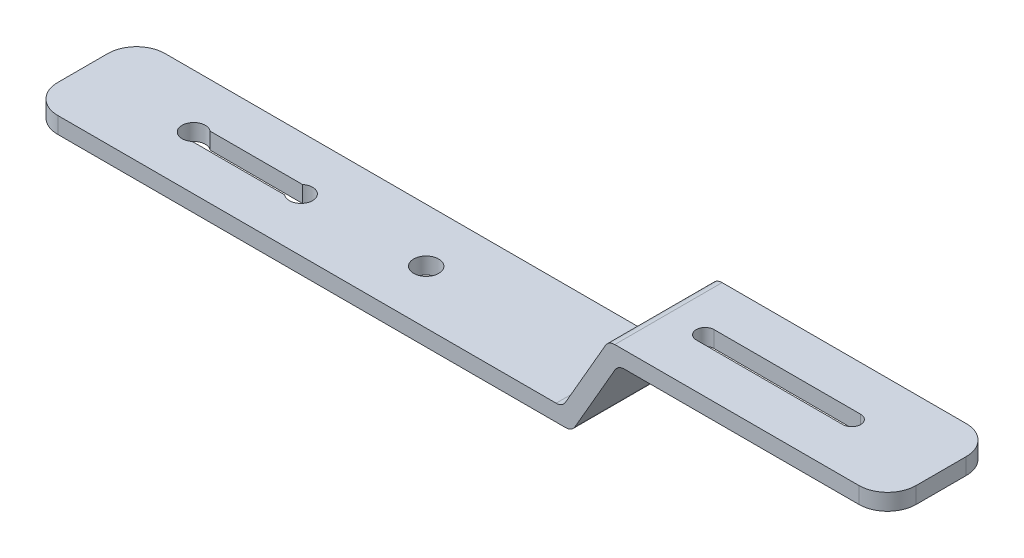
ISO-10303-21;
HEADER;
FILE_DESCRIPTION(('STEP AP214'),'2;1');
FILE_NAME('part.step','',(''),(''),'','','');
FILE_SCHEMA(('AUTOMOTIVE_DESIGN { 1 0 10303 214 1 1 1 1 }'));
ENDSEC;
DATA;
#1=APPLICATION_CONTEXT('core data for automotive mechanical design processes');
#2=APPLICATION_PROTOCOL_DEFINITION('international standard','automotive_design',2000,#1);
#3=PRODUCT_CONTEXT('',#1,'mechanical');
#4=PRODUCT('Part','Part','',(#3));
#5=PRODUCT_RELATED_PRODUCT_CATEGORY('part','',(#4));
#6=PRODUCT_DEFINITION_FORMATION('','',#4);
#7=PRODUCT_DEFINITION_CONTEXT('part definition',#1,'design');
#8=PRODUCT_DEFINITION('design','',#6,#7);
#9=PRODUCT_DEFINITION_SHAPE('','',#8);
#10=(LENGTH_UNIT() NAMED_UNIT(*) SI_UNIT(.MILLI.,.METRE.));
#11=(NAMED_UNIT(*) PLANE_ANGLE_UNIT() SI_UNIT($,.RADIAN.));
#12=(NAMED_UNIT(*) SI_UNIT($,.STERADIAN.) SOLID_ANGLE_UNIT());
#13=UNCERTAINTY_MEASURE_WITH_UNIT(LENGTH_MEASURE(1.E-05),#10,'distance_accuracy_value','');
#14=(GEOMETRIC_REPRESENTATION_CONTEXT(3) GLOBAL_UNCERTAINTY_ASSIGNED_CONTEXT((#13)) GLOBAL_UNIT_ASSIGNED_CONTEXT((#10,
#11,#12)) REPRESENTATION_CONTEXT('',''));
#15=CARTESIAN_POINT('',(0.,0.,0.));
#16=DIRECTION('',(0.,0.,1.));
#17=DIRECTION('',(1.,0.,0.));
#18=AXIS2_PLACEMENT_3D('',#15,#16,#17);
#19=CARTESIAN_POINT('',(0.,4.6,15.));
#20=DIRECTION('',(1.,0.,0.));
#21=DIRECTION('',(0.,1.,0.));
#22=AXIS2_PLACEMENT_3D('',#19,#20,#21);
#23=PLANE('',#22);
#24=DIRECTION('',(0.,0.,-1.));
#25=VECTOR('',#24,1.);
#26=CARTESIAN_POINT('',(0.,0.,15.));
#27=LINE('',#26,#25);
#28=CARTESIAN_POINT('',(0.,0.,7.));
#29=VERTEX_POINT('',#28);
#30=CARTESIAN_POINT('',(0.,0.,-7.));
#31=VERTEX_POINT('',#30);
#32=EDGE_CURVE('E356',#29,#31,#27,.T.);
#33=ORIENTED_EDGE('',*,*,#32,.F.);
#34=DIRECTION('',(0.,-1.,0.));
#35=VECTOR('',#34,1.);
#36=CARTESIAN_POINT('',(0.,4.6,7.));
#37=LINE('',#36,#35);
#38=CARTESIAN_POINT('',(0.,4.6,7.));
#39=VERTEX_POINT('',#38);
#40=EDGE_CURVE('E387',#29,#39,#37,.F.);
#41=ORIENTED_EDGE('',*,*,#40,.T.);
#42=DIRECTION('',(0.,0.,-1.));
#43=VECTOR('',#42,1.);
#44=CARTESIAN_POINT('',(0.,4.6,15.));
#45=LINE('',#44,#43);
#46=CARTESIAN_POINT('',(0.,4.6,-7.));
#47=VERTEX_POINT('',#46);
#48=EDGE_CURVE('E303',#39,#47,#45,.T.);
#49=ORIENTED_EDGE('',*,*,#48,.T.);
#50=DIRECTION('',(0.,-1.,0.));
#51=VECTOR('',#50,1.);
#52=CARTESIAN_POINT('',(0.,0.,-7.));
#53=LINE('',#52,#51);
#54=EDGE_CURVE('E384',#47,#31,#53,.T.);
#55=ORIENTED_EDGE('',*,*,#54,.T.);
#56=EDGE_LOOP('',(#33,#41,#49,#55));
#57=FACE_BOUND('',#56,.T.);
#58=ADVANCED_FACE('F35',(#57),#23,.F.);
#59=CARTESIAN_POINT('',(150.,-1.0495153170664E-12,15.));
#60=DIRECTION('',(0.,1.,0.));
#61=DIRECTION('',(-1.,0.,0.));
#62=AXIS2_PLACEMENT_3D('',#59,#60,#61);
#63=PLANE('',#62);
#64=CARTESIAN_POINT('',(96.,-1.7277845820729E-12,0.));
#65=DIRECTION('',(0.,1.,0.));
#66=DIRECTION('',(-1.,0.,0.));
#67=AXIS2_PLACEMENT_3D('',#64,#65,#66);
#68=CIRCLE('',#67,3.50000000000001);
#69=CARTESIAN_POINT('',(92.5,-1.70334915231725E-12,0.));
#70=VERTEX_POINT('',#69);
#71=EDGE_CURVE('E242',#70,#70,#68,.T.);
#72=ORIENTED_EDGE('',*,*,#71,.T.);
#73=EDGE_LOOP('',(#72));
#74=FACE_BOUND('',#73,.T.);
#75=DIRECTION('',(-1.,0.,0.));
#76=VECTOR('',#75,1.);
#77=CARTESIAN_POINT('',(33.0766559657296,-1.05731395860786E-12,-2.5));
#78=LINE('',#77,#76);
#79=CARTESIAN_POINT('',(58.9233440342705,-1.0547118733939E-12,-2.5));
#80=VERTEX_POINT('',#79);
#81=CARTESIAN_POINT('',(33.0766559657296,-1.05731395860786E-12,-2.5));
#82=VERTEX_POINT('',#81);
#83=EDGE_CURVE('E258',#80,#82,#78,.T.);
#84=ORIENTED_EDGE('',*,*,#83,.T.);
#85=CARTESIAN_POINT('',(31.,-1.05731395860786E-12,0.));
#86=DIRECTION('',(0.,1.,0.));
#87=DIRECTION('',(-1.,0.,0.));
#88=AXIS2_PLACEMENT_3D('',#85,#86,#87);
#89=CIRCLE('',#88,3.25);
#90=CARTESIAN_POINT('',(33.0766559657296,-1.05731395860786E-12,2.5));
#91=VERTEX_POINT('',#90);
#92=EDGE_CURVE('E248',#82,#91,#89,.T.);
#93=ORIENTED_EDGE('',*,*,#92,.T.);
#94=DIRECTION('',(1.,0.,0.));
#95=VECTOR('',#94,1.);
#96=CARTESIAN_POINT('',(33.0766559657296,-1.05731395860786E-12,2.5));
#97=LINE('',#96,#95);
#98=CARTESIAN_POINT('',(58.9233440342705,-4.12273013978266E-13,2.5));
#99=VERTEX_POINT('',#98);
#100=EDGE_CURVE('E251',#91,#99,#97,.T.);
#101=ORIENTED_EDGE('',*,*,#100,.T.);
#102=CARTESIAN_POINT('',(61.,-1.0547118733939E-12,0.));
#103=DIRECTION('',(0.,1.,0.));
#104=DIRECTION('',(1.,0.,0.));
#105=AXIS2_PLACEMENT_3D('',#102,#103,#104);
#106=CIRCLE('',#105,3.25);
#107=EDGE_CURVE('E255',#99,#80,#106,.T.);
#108=ORIENTED_EDGE('',*,*,#107,.T.);
#109=EDGE_LOOP('',(#84,#93,#101,#108));
#110=FACE_BOUND('',#109,.T.);
#111=DIRECTION('',(1.,0.,0.));
#112=VECTOR('',#111,1.);
#113=CARTESIAN_POINT('',(150.,-1.0495153170664E-12,15.));
#114=LINE('',#113,#112);
#115=CARTESIAN_POINT('',(8.00000000000001,0.,15.));
#116=VERTEX_POINT('',#115);
#117=CARTESIAN_POINT('',(150.,-1.04083408558608E-12,15.));
#118=VERTEX_POINT('',#117);
#119=EDGE_CURVE('E280',#116,#118,#114,.T.);
#120=ORIENTED_EDGE('',*,*,#119,.F.);
#121=CARTESIAN_POINT('',(8.00000000000001,0.,7.));
#122=DIRECTION('',(0.,1.,0.));
#123=DIRECTION('',(-1.,0.,0.));
#124=AXIS2_PLACEMENT_3D('',#121,#122,#123);
#125=CIRCLE('',#124,8.);
#126=EDGE_CURVE('E382',#116,#29,#125,.F.);
#127=ORIENTED_EDGE('',*,*,#126,.T.);
#128=ORIENTED_EDGE('',*,*,#32,.T.);
#129=CARTESIAN_POINT('',(8.,0.,-7.));
#130=DIRECTION('',(0.,1.,0.));
#131=DIRECTION('',(-1.,0.,0.));
#132=AXIS2_PLACEMENT_3D('',#129,#130,#131);
#133=CIRCLE('',#132,8.);
#134=CARTESIAN_POINT('',(8.00000000000001,0.,-15.));
#135=VERTEX_POINT('',#134);
#136=EDGE_CURVE('E380',#31,#135,#133,.F.);
#137=ORIENTED_EDGE('',*,*,#136,.T.);
#138=DIRECTION('',(1.,0.,0.));
#139=VECTOR('',#138,1.);
#140=CARTESIAN_POINT('',(150.,-1.0495153170664E-12,-15.));
#141=LINE('',#140,#139);
#142=CARTESIAN_POINT('',(150.,-1.04083408558608E-12,-15.));
#143=VERTEX_POINT('',#142);
#144=EDGE_CURVE('E273',#135,#143,#141,.T.);
#145=ORIENTED_EDGE('',*,*,#144,.T.);
#146=DIRECTION('',(0.,0.,-1.));
#147=VECTOR('',#146,1.);
#148=CARTESIAN_POINT('',(150.,-1.04083408558608E-12,15.));
#149=LINE('',#148,#147);
#150=EDGE_CURVE('E353',#118,#143,#149,.T.);
#151=ORIENTED_EDGE('',*,*,#150,.F.);
#152=EDGE_LOOP('',(#120,#127,#128,#137,#145,#151));
#153=FACE_BOUND('',#152,.T.);
#154=ADVANCED_FACE('F403',(#74,#110,#153),#63,.F.);
#155=CARTESIAN_POINT('',(150.,2.99999999999949,15.));
#156=DIRECTION('',(0.,0.,-1.));
#157=DIRECTION('',(-1.,0.,0.));
#158=AXIS2_PLACEMENT_3D('',#155,#156,#157);
#159=CYLINDRICAL_SURFACE('',#158,3.00000000000053);
#160=CARTESIAN_POINT('',(150.,2.99999999999949,-15.));
#161=DIRECTION('',(0.,0.,1.));
#162=DIRECTION('',(-1.,0.,0.));
#163=AXIS2_PLACEMENT_3D('',#160,#161,#162);
#164=CIRCLE('',#163,3.00000000000053);
#165=CARTESIAN_POINT('',(152.598076211354,1.49999999999923,-15.));
#166=VERTEX_POINT('',#165);
#167=EDGE_CURVE('E305',#143,#166,#164,.T.);
#168=ORIENTED_EDGE('',*,*,#167,.T.);
#169=DIRECTION('',(0.,0.,-1.));
#170=VECTOR('',#169,1.);
#171=CARTESIAN_POINT('',(152.598076211354,1.49999999999923,15.));
#172=LINE('',#171,#170);
#173=CARTESIAN_POINT('',(152.598076211354,1.49999999999923,15.));
#174=VERTEX_POINT('',#173);
#175=EDGE_CURVE('E350',#174,#166,#172,.T.);
#176=ORIENTED_EDGE('',*,*,#175,.F.);
#177=CARTESIAN_POINT('',(150.,2.99999999999949,15.));
#178=DIRECTION('',(0.,0.,1.));
#179=DIRECTION('',(-1.,0.,0.));
#180=AXIS2_PLACEMENT_3D('',#177,#178,#179);
#181=CIRCLE('',#180,3.00000000000053);
#182=EDGE_CURVE('E282',#118,#174,#181,.T.);
#183=ORIENTED_EDGE('',*,*,#182,.F.);
#184=ORIENTED_EDGE('',*,*,#150,.T.);
#185=EDGE_LOOP('',(#168,#176,#183,#184));
#186=FACE_BOUND('',#185,.T.);
#187=ADVANCED_FACE('F413',(#186),#159,.T.);
#188=CARTESIAN_POINT('',(159.381107666143,13.2485551090319,15.));
#189=DIRECTION('',(-0.866025403784444,0.49999999999999,0.));
#190=DIRECTION('',(-0.49999999999999,-0.866025403784444,0.));
#191=AXIS2_PLACEMENT_3D('',#188,#189,#190);
#192=PLANE('',#191);
#193=DIRECTION('',(0.49999999999999,0.866025403784444,0.));
#194=VECTOR('',#193,1.);
#195=CARTESIAN_POINT('',(159.381107666143,13.2485551090319,-15.));
#196=LINE('',#195,#194);
#197=CARTESIAN_POINT('',(163.79867143363,20.8999999999955,-15.));
#198=VERTEX_POINT('',#197);
#199=EDGE_CURVE('E308',#166,#198,#196,.T.);
#200=ORIENTED_EDGE('',*,*,#199,.T.);
#201=DIRECTION('',(0.,0.,-1.));
#202=VECTOR('',#201,1.);
#203=CARTESIAN_POINT('',(163.79867143363,20.8999999999955,15.));
#204=LINE('',#203,#202);
#205=CARTESIAN_POINT('',(163.79867143363,20.8999999999955,15.));
#206=VERTEX_POINT('',#205);
#207=EDGE_CURVE('E347',#206,#198,#204,.T.);
#208=ORIENTED_EDGE('',*,*,#207,.F.);
#209=DIRECTION('',(0.500000000000007,0.866025403784434,0.));
#210=VECTOR('',#209,1.);
#211=CARTESIAN_POINT('',(159.381107666143,13.2485551090319,15.));
#212=LINE('',#211,#210);
#213=EDGE_CURVE('E285',#174,#206,#212,.T.);
#214=ORIENTED_EDGE('',*,*,#213,.F.);
#215=ORIENTED_EDGE('',*,*,#175,.T.);
#216=EDGE_LOOP('',(#200,#208,#214,#215));
#217=FACE_BOUND('',#216,.T.);
#218=ADVANCED_FACE('F417',(#217),#192,.F.);
#219=CARTESIAN_POINT('',(166.396747644983,19.3999999999958,15.));
#220=DIRECTION('',(0.,0.,-1.));
#221=DIRECTION('',(-1.,0.,0.));
#222=AXIS2_PLACEMENT_3D('',#219,#220,#221);
#223=CYLINDRICAL_SURFACE('',#222,2.99999999999956);
#224=CARTESIAN_POINT('',(166.396747644983,19.3999999999958,-15.));
#225=DIRECTION('',(0.,0.,-1.));
#226=DIRECTION('',(-1.,0.,0.));
#227=AXIS2_PLACEMENT_3D('',#224,#225,#226);
#228=CIRCLE('',#227,2.99999999999956);
#229=CARTESIAN_POINT('',(166.396747644983,22.3999999999953,-15.));
#230=VERTEX_POINT('',#229);
#231=EDGE_CURVE('E310',#198,#230,#228,.T.);
#232=ORIENTED_EDGE('',*,*,#231,.T.);
#233=DIRECTION('',(0.,0.,-1.));
#234=VECTOR('',#233,1.);
#235=CARTESIAN_POINT('',(166.396747644983,22.3999999999953,15.));
#236=LINE('',#235,#234);
#237=CARTESIAN_POINT('',(166.396747644983,22.3999999999953,15.));
#238=VERTEX_POINT('',#237);
#239=EDGE_CURVE('E344',#238,#230,#236,.T.);
#240=ORIENTED_EDGE('',*,*,#239,.F.);
#241=CARTESIAN_POINT('',(166.396747644983,19.3999999999958,15.));
#242=DIRECTION('',(0.,0.,-1.));
#243=DIRECTION('',(-1.,0.,0.));
#244=AXIS2_PLACEMENT_3D('',#241,#242,#243);
#245=CIRCLE('',#244,2.99999999999956);
#246=EDGE_CURVE('E287',#206,#238,#245,.T.);
#247=ORIENTED_EDGE('',*,*,#246,.F.);
#248=ORIENTED_EDGE('',*,*,#207,.T.);
#249=EDGE_LOOP('',(#232,#240,#247,#248));
#250=FACE_BOUND('',#249,.T.);
#251=ADVANCED_FACE('F424',(#250),#223,.F.);
#252=CARTESIAN_POINT('',(166.396747644983,22.3999999999953,15.));
#253=DIRECTION('',(0.,1.,0.));
#254=DIRECTION('',(-1.,0.,0.));
#255=AXIS2_PLACEMENT_3D('',#252,#253,#254);
#256=PLANE('',#255);
#257=DIRECTION('',(1.,0.,0.));
#258=VECTOR('',#257,1.);
#259=CARTESIAN_POINT('',(166.396747644983,22.3999999999953,2.5));
#260=LINE('',#259,#258);
#261=CARTESIAN_POINT('',(174.,22.3999999999953,2.5));
#262=VERTEX_POINT('',#261);
#263=CARTESIAN_POINT('',(215.,22.3999999999951,2.5));
#264=VERTEX_POINT('',#263);
#265=EDGE_CURVE('E235',#262,#264,#260,.T.);
#266=ORIENTED_EDGE('',*,*,#265,.T.);
#267=CARTESIAN_POINT('',(215.,22.399999999995,0.));
#268=DIRECTION('',(0.,1.,0.));
#269=DIRECTION('',(-1.,0.,0.));
#270=AXIS2_PLACEMENT_3D('',#267,#268,#269);
#271=CIRCLE('',#270,2.5);
#272=CARTESIAN_POINT('',(215.,22.3999999999951,-2.5));
#273=VERTEX_POINT('',#272);
#274=EDGE_CURVE('E238',#264,#273,#271,.T.);
#275=ORIENTED_EDGE('',*,*,#274,.T.);
#276=DIRECTION('',(-1.,0.,0.));
#277=VECTOR('',#276,1.);
#278=CARTESIAN_POINT('',(166.396747644983,22.3999999999953,-2.5));
#279=LINE('',#278,#277);
#280=CARTESIAN_POINT('',(173.999999999999,22.3999999999953,-2.5));
#281=VERTEX_POINT('',#280);
#282=EDGE_CURVE('E230',#273,#281,#279,.T.);
#283=ORIENTED_EDGE('',*,*,#282,.T.);
#284=CARTESIAN_POINT('',(174.,22.3999999999953,0.));
#285=DIRECTION('',(0.,1.,0.));
#286=DIRECTION('',(-1.,0.,0.));
#287=AXIS2_PLACEMENT_3D('',#284,#285,#286);
#288=CIRCLE('',#287,2.5);
#289=EDGE_CURVE('E205',#281,#262,#288,.T.);
#290=ORIENTED_EDGE('',*,*,#289,.T.);
#291=EDGE_LOOP('',(#266,#275,#283,#290));
#292=FACE_BOUND('',#291,.T.);
#293=DIRECTION('',(1.,0.,0.));
#294=VECTOR('',#293,1.);
#295=CARTESIAN_POINT('',(166.396747644983,22.3999999999953,-15.));
#296=LINE('',#295,#294);
#297=CARTESIAN_POINT('',(232.,22.3999999999949,-15.));
#298=VERTEX_POINT('',#297);
#299=EDGE_CURVE('E312',#230,#298,#296,.T.);
#300=ORIENTED_EDGE('',*,*,#299,.T.);
#301=CARTESIAN_POINT('',(232.,22.3999999999949,-7.));
#302=DIRECTION('',(0.,1.,0.));
#303=DIRECTION('',(-1.,0.,0.));
#304=AXIS2_PLACEMENT_3D('',#301,#302,#303);
#305=CIRCLE('',#304,8.);
#306=CARTESIAN_POINT('',(240.,22.3999999999948,-7.));
#307=VERTEX_POINT('',#306);
#308=EDGE_CURVE('E372',#298,#307,#305,.F.);
#309=ORIENTED_EDGE('',*,*,#308,.T.);
#310=DIRECTION('',(0.,0.,-1.));
#311=VECTOR('',#310,1.);
#312=CARTESIAN_POINT('',(240.,22.3999999999948,15.));
#313=LINE('',#312,#311);
#314=CARTESIAN_POINT('',(240.,22.3999999999948,7.));
#315=VERTEX_POINT('',#314);
#316=EDGE_CURVE('E341',#315,#307,#313,.T.);
#317=ORIENTED_EDGE('',*,*,#316,.F.);
#318=CARTESIAN_POINT('',(232.,22.3999999999949,7.));
#319=DIRECTION('',(0.,1.,0.));
#320=DIRECTION('',(-1.,0.,0.));
#321=AXIS2_PLACEMENT_3D('',#318,#319,#320);
#322=CIRCLE('',#321,8.);
#323=CARTESIAN_POINT('',(232.,22.3999999999949,15.));
#324=VERTEX_POINT('',#323);
#325=EDGE_CURVE('E370',#315,#324,#322,.F.);
#326=ORIENTED_EDGE('',*,*,#325,.T.);
#327=DIRECTION('',(1.,0.,0.));
#328=VECTOR('',#327,1.);
#329=CARTESIAN_POINT('',(166.396747644983,22.3999999999953,15.));
#330=LINE('',#329,#328);
#331=EDGE_CURVE('E289',#238,#324,#330,.T.);
#332=ORIENTED_EDGE('',*,*,#331,.F.);
#333=ORIENTED_EDGE('',*,*,#239,.T.);
#334=EDGE_LOOP('',(#300,#309,#317,#326,#332,#333));
#335=FACE_BOUND('',#334,.T.);
#336=ADVANCED_FACE('F427',(#292,#335),#256,.F.);
#337=CARTESIAN_POINT('',(240.,22.3999999999948,15.));
#338=DIRECTION('',(-1.,0.,0.));
#339=DIRECTION('',(0.,-1.,0.));
#340=AXIS2_PLACEMENT_3D('',#337,#338,#339);
#341=PLANE('',#340);
#342=ORIENTED_EDGE('',*,*,#316,.T.);
#343=DIRECTION('',(0.,1.,0.));
#344=VECTOR('',#343,1.);
#345=CARTESIAN_POINT('',(240.,26.9999999999948,-7.));
#346=LINE('',#345,#344);
#347=CARTESIAN_POINT('',(240.,26.9999999999948,-7.));
#348=VERTEX_POINT('',#347);
#349=EDGE_CURVE('E361',#307,#348,#346,.T.);
#350=ORIENTED_EDGE('',*,*,#349,.T.);
#351=DIRECTION('',(0.,0.,-1.));
#352=VECTOR('',#351,1.);
#353=CARTESIAN_POINT('',(240.,26.9999999999948,15.));
#354=LINE('',#353,#352);
#355=CARTESIAN_POINT('',(240.,26.9999999999948,7.));
#356=VERTEX_POINT('',#355);
#357=EDGE_CURVE('E338',#356,#348,#354,.T.);
#358=ORIENTED_EDGE('',*,*,#357,.F.);
#359=DIRECTION('',(0.,1.,0.));
#360=VECTOR('',#359,1.);
#361=CARTESIAN_POINT('',(240.,22.3999999999948,7.));
#362=LINE('',#361,#360);
#363=EDGE_CURVE('E359',#356,#315,#362,.F.);
#364=ORIENTED_EDGE('',*,*,#363,.T.);
#365=EDGE_LOOP('',(#342,#350,#358,#364));
#366=FACE_BOUND('',#365,.T.);
#367=ADVANCED_FACE('F455',(#366),#341,.F.);
#368=CARTESIAN_POINT('',(163.740936406713,26.9999999999978,15.));
#369=DIRECTION('',(0.,-1.,0.));
#370=DIRECTION('',(1.,0.,0.));
#371=AXIS2_PLACEMENT_3D('',#368,#369,#370);
#372=PLANE('',#371);
#373=DIRECTION('',(-1.,0.,0.));
#374=VECTOR('',#373,1.);
#375=CARTESIAN_POINT('',(174.,26.9999999999974,-2.5));
#376=LINE('',#375,#374);
#377=CARTESIAN_POINT('',(215.,26.9999999999958,-2.5));
#378=VERTEX_POINT('',#377);
#379=CARTESIAN_POINT('',(174.,26.9999999999974,-2.5));
#380=VERTEX_POINT('',#379);
#381=EDGE_CURVE('E213',#378,#380,#376,.T.);
#382=ORIENTED_EDGE('',*,*,#381,.F.);
#383=CARTESIAN_POINT('',(215.,26.9999999999958,0.));
#384=DIRECTION('',(0.,1.,0.));
#385=DIRECTION('',(1.,0.,0.));
#386=AXIS2_PLACEMENT_3D('',#383,#384,#385);
#387=CIRCLE('',#386,2.5);
#388=CARTESIAN_POINT('',(215.,26.9999999999958,2.5));
#389=VERTEX_POINT('',#388);
#390=EDGE_CURVE('E218',#389,#378,#387,.T.);
#391=ORIENTED_EDGE('',*,*,#390,.F.);
#392=DIRECTION('',(1.,0.,0.));
#393=VECTOR('',#392,1.);
#394=CARTESIAN_POINT('',(174.,26.9999999999974,2.5));
#395=LINE('',#394,#393);
#396=CARTESIAN_POINT('',(174.,26.9999999999974,2.5));
#397=VERTEX_POINT('',#396);
#398=EDGE_CURVE('E223',#397,#389,#395,.T.);
#399=ORIENTED_EDGE('',*,*,#398,.F.);
#400=CARTESIAN_POINT('',(174.,26.9999999999974,0.));
#401=DIRECTION('',(0.,1.,0.));
#402=DIRECTION('',(1.,0.,0.));
#403=AXIS2_PLACEMENT_3D('',#400,#401,#402);
#404=CIRCLE('',#403,2.5);
#405=EDGE_CURVE('E202',#380,#397,#404,.T.);
#406=ORIENTED_EDGE('',*,*,#405,.F.);
#407=EDGE_LOOP('',(#382,#391,#399,#406));
#408=FACE_BOUND('',#407,.T.);
#409=ORIENTED_EDGE('',*,*,#357,.T.);
#410=CARTESIAN_POINT('',(232.,26.9999999999951,-7.));
#411=DIRECTION('',(0.,-1.,0.));
#412=DIRECTION('',(1.,0.,0.));
#413=AXIS2_PLACEMENT_3D('',#410,#411,#412);
#414=CIRCLE('',#413,8.);
#415=CARTESIAN_POINT('',(232.,26.9999999999951,-15.));
#416=VERTEX_POINT('',#415);
#417=EDGE_CURVE('E366',#348,#416,#414,.F.);
#418=ORIENTED_EDGE('',*,*,#417,.T.);
#419=DIRECTION('',(-1.,0.,0.));
#420=VECTOR('',#419,1.);
#421=CARTESIAN_POINT('',(163.740936406713,26.9999999999978,-15.));
#422=LINE('',#421,#420);
#423=CARTESIAN_POINT('',(163.740936406713,26.9999999999979,-15.));
#424=VERTEX_POINT('',#423);
#425=EDGE_CURVE('E315',#416,#424,#422,.T.);
#426=ORIENTED_EDGE('',*,*,#425,.T.);
#427=DIRECTION('',(0.,0.,-1.));
#428=VECTOR('',#427,1.);
#429=CARTESIAN_POINT('',(163.740936406713,26.9999999999979,15.));
#430=LINE('',#429,#428);
#431=CARTESIAN_POINT('',(163.740936406713,26.9999999999979,15.));
#432=VERTEX_POINT('',#431);
#433=EDGE_CURVE('E335',#432,#424,#430,.T.);
#434=ORIENTED_EDGE('',*,*,#433,.F.);
#435=DIRECTION('',(-1.,0.,0.));
#436=VECTOR('',#435,1.);
#437=CARTESIAN_POINT('',(163.740936406713,26.9999999999978,15.));
#438=LINE('',#437,#436);
#439=CARTESIAN_POINT('',(232.,26.9999999999951,15.));
#440=VERTEX_POINT('',#439);
#441=EDGE_CURVE('E292',#440,#432,#438,.T.);
#442=ORIENTED_EDGE('',*,*,#441,.F.);
#443=CARTESIAN_POINT('',(232.,26.9999999999951,7.));
#444=DIRECTION('',(0.,-1.,0.));
#445=DIRECTION('',(1.,0.,0.));
#446=AXIS2_PLACEMENT_3D('',#443,#444,#445);
#447=CIRCLE('',#446,8.);
#448=EDGE_CURVE('E364',#440,#356,#447,.F.);
#449=ORIENTED_EDGE('',*,*,#448,.T.);
#450=EDGE_LOOP('',(#409,#418,#426,#434,#442,#449));
#451=FACE_BOUND('',#450,.T.);
#452=ADVANCED_FACE('F220',(#408,#451),#372,.F.);
#453=CARTESIAN_POINT('',(163.740936406713,23.9999999999982,15.));
#454=DIRECTION('',(0.,0.,-1.));
#455=DIRECTION('',(-1.,0.,0.));
#456=AXIS2_PLACEMENT_3D('',#453,#454,#455);
#457=CYLINDRICAL_SURFACE('',#456,2.99999999999967);
#458=CARTESIAN_POINT('',(163.740936406713,23.9999999999982,-15.));
#459=DIRECTION('',(0.,0.,1.));
#460=DIRECTION('',(-1.,0.,0.));
#461=AXIS2_PLACEMENT_3D('',#458,#459,#460);
#462=CIRCLE('',#461,2.99999999999967);
#463=CARTESIAN_POINT('',(161.14286019536,25.499999999998,-15.));
#464=VERTEX_POINT('',#463);
#465=EDGE_CURVE('E317',#424,#464,#462,.T.);
#466=ORIENTED_EDGE('',*,*,#465,.T.);
#467=DIRECTION('',(0.,0.,-1.));
#468=VECTOR('',#467,1.);
#469=CARTESIAN_POINT('',(161.14286019536,25.499999999998,15.));
#470=LINE('',#469,#468);
#471=CARTESIAN_POINT('',(161.14286019536,25.499999999998,15.));
#472=VERTEX_POINT('',#471);
#473=EDGE_CURVE('E332',#472,#464,#470,.T.);
#474=ORIENTED_EDGE('',*,*,#473,.F.);
#475=CARTESIAN_POINT('',(163.740936406713,23.9999999999982,15.));
#476=DIRECTION('',(0.,0.,1.));
#477=DIRECTION('',(-1.,0.,0.));
#478=AXIS2_PLACEMENT_3D('',#475,#476,#477);
#479=CIRCLE('',#478,2.99999999999967);
#480=EDGE_CURVE('E294',#432,#472,#479,.T.);
#481=ORIENTED_EDGE('',*,*,#480,.F.);
#482=ORIENTED_EDGE('',*,*,#433,.T.);
#483=EDGE_LOOP('',(#466,#474,#481,#482));
#484=FACE_BOUND('',#483,.T.);
#485=ADVANCED_FACE('F441',(#484),#457,.T.);
#486=CARTESIAN_POINT('',(155.397390808735,15.548555109032,15.));
#487=DIRECTION('',(0.866025403784436,-0.500000000000005,0.));
#488=DIRECTION('',(0.500000000000005,0.866025403784436,0.));
#489=AXIS2_PLACEMENT_3D('',#486,#487,#488);
#490=PLANE('',#489);
#491=DIRECTION('',(-0.500000000000005,-0.866025403784436,0.));
#492=VECTOR('',#491,1.);
#493=CARTESIAN_POINT('',(155.397390808735,15.548555109032,-15.));
#494=LINE('',#493,#492);
#495=CARTESIAN_POINT('',(149.942264973082,6.09999999999924,-15.));
#496=VERTEX_POINT('',#495);
#497=EDGE_CURVE('E320',#464,#496,#494,.T.);
#498=ORIENTED_EDGE('',*,*,#497,.T.);
#499=DIRECTION('',(0.,0.,-1.));
#500=VECTOR('',#499,1.);
#501=CARTESIAN_POINT('',(149.942264973082,6.09999999999924,15.));
#502=LINE('',#501,#500);
#503=CARTESIAN_POINT('',(149.942264973082,6.09999999999924,15.));
#504=VERTEX_POINT('',#503);
#505=EDGE_CURVE('E329',#504,#496,#502,.T.);
#506=ORIENTED_EDGE('',*,*,#505,.F.);
#507=DIRECTION('',(-0.499999999999993,-0.866025403784442,0.));
#508=VECTOR('',#507,1.);
#509=CARTESIAN_POINT('',(155.397390808735,15.548555109032,15.));
#510=LINE('',#509,#508);
#511=EDGE_CURVE('E296',#472,#504,#510,.T.);
#512=ORIENTED_EDGE('',*,*,#511,.F.);
#513=ORIENTED_EDGE('',*,*,#473,.T.);
#514=EDGE_LOOP('',(#498,#506,#512,#513));
#515=FACE_BOUND('',#514,.T.);
#516=ADVANCED_FACE('F445',(#515),#490,.F.);
#517=CARTESIAN_POINT('',(147.344188761728,7.59999999999951,15.));
#518=DIRECTION('',(0.,0.,-1.));
#519=DIRECTION('',(-1.,0.,0.));
#520=AXIS2_PLACEMENT_3D('',#517,#518,#519);
#521=CYLINDRICAL_SURFACE('',#520,3.00000000000055);
#522=CARTESIAN_POINT('',(147.344188761728,7.59999999999951,-15.));
#523=DIRECTION('',(0.,0.,-1.));
#524=DIRECTION('',(-1.,0.,0.));
#525=AXIS2_PLACEMENT_3D('',#522,#523,#524);
#526=CIRCLE('',#525,3.00000000000055);
#527=CARTESIAN_POINT('',(147.344188761728,4.59999999999897,-15.));
#528=VERTEX_POINT('',#527);
#529=EDGE_CURVE('E322',#496,#528,#526,.T.);
#530=ORIENTED_EDGE('',*,*,#529,.T.);
#531=DIRECTION('',(0.,0.,-1.));
#532=VECTOR('',#531,1.);
#533=CARTESIAN_POINT('',(147.344188761728,4.59999999999897,15.));
#534=LINE('',#533,#532);
#535=CARTESIAN_POINT('',(147.344188761728,4.59999999999897,15.));
#536=VERTEX_POINT('',#535);
#537=EDGE_CURVE('E326',#536,#528,#534,.T.);
#538=ORIENTED_EDGE('',*,*,#537,.F.);
#539=CARTESIAN_POINT('',(147.344188761728,7.59999999999951,15.));
#540=DIRECTION('',(0.,0.,-1.));
#541=DIRECTION('',(-1.,0.,0.));
#542=AXIS2_PLACEMENT_3D('',#539,#540,#541);
#543=CIRCLE('',#542,3.00000000000055);
#544=EDGE_CURVE('E298',#504,#536,#543,.T.);
#545=ORIENTED_EDGE('',*,*,#544,.F.);
#546=ORIENTED_EDGE('',*,*,#505,.T.);
#547=EDGE_LOOP('',(#530,#538,#545,#546));
#548=FACE_BOUND('',#547,.T.);
#549=ADVANCED_FACE('F448',(#548),#521,.F.);
#550=CARTESIAN_POINT('',(147.344188761728,4.59999999999897,15.));
#551=DIRECTION('',(0.,-1.,0.));
#552=DIRECTION('',(1.,0.,0.));
#553=AXIS2_PLACEMENT_3D('',#550,#551,#552);
#554=PLANE('',#553);
#555=CARTESIAN_POINT('',(96.,4.59999999999933,0.));
#556=DIRECTION('',(0.,1.,0.));
#557=DIRECTION('',(-1.,0.,0.));
#558=AXIS2_PLACEMENT_3D('',#555,#556,#557);
#559=CIRCLE('',#558,3.50000000000001);
#560=CARTESIAN_POINT('',(92.5,4.59999999999935,0.));
#561=VERTEX_POINT('',#560);
#562=EDGE_CURVE('E241',#561,#561,#559,.T.);
#563=ORIENTED_EDGE('',*,*,#562,.F.);
#564=EDGE_LOOP('',(#563));
#565=FACE_BOUND('',#564,.T.);
#566=DIRECTION('',(1.,0.,0.));
#567=VECTOR('',#566,1.);
#568=CARTESIAN_POINT('',(33.0766559657296,4.6,2.5));
#569=LINE('',#568,#567);
#570=CARTESIAN_POINT('',(33.0766559657296,4.59999999999977,2.5));
#571=VERTEX_POINT('',#570);
#572=CARTESIAN_POINT('',(58.9233440342705,4.6,2.5));
#573=VERTEX_POINT('',#572);
#574=EDGE_CURVE('E263',#571,#573,#569,.T.);
#575=ORIENTED_EDGE('',*,*,#574,.F.);
#576=CARTESIAN_POINT('',(31.,4.6,0.));
#577=DIRECTION('',(0.,1.,0.));
#578=DIRECTION('',(-1.,0.,0.));
#579=AXIS2_PLACEMENT_3D('',#576,#577,#578);
#580=CIRCLE('',#579,3.25);
#581=CARTESIAN_POINT('',(33.0766559657296,4.6,-2.5));
#582=VERTEX_POINT('',#581);
#583=EDGE_CURVE('E245',#582,#571,#580,.T.);
#584=ORIENTED_EDGE('',*,*,#583,.F.);
#585=DIRECTION('',(-1.,0.,0.));
#586=VECTOR('',#585,1.);
#587=CARTESIAN_POINT('',(33.0766559657296,4.6,-2.5));
#588=LINE('',#587,#586);
#589=CARTESIAN_POINT('',(58.9233440342705,4.6,-2.5));
#590=VERTEX_POINT('',#589);
#591=EDGE_CURVE('E252',#590,#582,#588,.T.);
#592=ORIENTED_EDGE('',*,*,#591,.F.);
#593=CARTESIAN_POINT('',(61.,4.6,0.));
#594=DIRECTION('',(0.,1.,0.));
#595=DIRECTION('',(1.,0.,0.));
#596=AXIS2_PLACEMENT_3D('',#593,#594,#595);
#597=CIRCLE('',#596,3.25);
#598=EDGE_CURVE('E266',#573,#590,#597,.T.);
#599=ORIENTED_EDGE('',*,*,#598,.F.);
#600=EDGE_LOOP('',(#575,#584,#592,#599));
#601=FACE_BOUND('',#600,.T.);
#602=ORIENTED_EDGE('',*,*,#48,.F.);
#603=CARTESIAN_POINT('',(8.00000000000004,4.59999999999994,7.));
#604=DIRECTION('',(0.,-1.,0.));
#605=DIRECTION('',(1.,0.,0.));
#606=AXIS2_PLACEMENT_3D('',#603,#604,#605);
#607=CIRCLE('',#606,8.);
#608=CARTESIAN_POINT('',(8.00000000000004,4.59999999999994,15.));
#609=VERTEX_POINT('',#608);
#610=EDGE_CURVE('E43',#39,#609,#607,.F.);
#611=ORIENTED_EDGE('',*,*,#610,.T.);
#612=DIRECTION('',(-1.,0.,0.));
#613=VECTOR('',#612,1.);
#614=CARTESIAN_POINT('',(147.344188761728,4.59999999999897,15.));
#615=LINE('',#614,#613);
#616=EDGE_CURVE('E300',#536,#609,#615,.T.);
#617=ORIENTED_EDGE('',*,*,#616,.F.);
#618=ORIENTED_EDGE('',*,*,#537,.T.);
#619=DIRECTION('',(-1.,0.,0.));
#620=VECTOR('',#619,1.);
#621=CARTESIAN_POINT('',(147.344188761728,4.59999999999897,-15.));
#622=LINE('',#621,#620);
#623=CARTESIAN_POINT('',(8.00000000000004,4.59999999999994,-15.));
#624=VERTEX_POINT('',#623);
#625=EDGE_CURVE('E283',#528,#624,#622,.T.);
#626=ORIENTED_EDGE('',*,*,#625,.T.);
#627=CARTESIAN_POINT('',(8.00000000000003,4.59999999999994,-7.));
#628=DIRECTION('',(0.,-1.,0.));
#629=DIRECTION('',(1.,0.,0.));
#630=AXIS2_PLACEMENT_3D('',#627,#628,#629);
#631=CIRCLE('',#630,8.);
#632=EDGE_CURVE('E55',#624,#47,#631,.F.);
#633=ORIENTED_EDGE('',*,*,#632,.T.);
#634=EDGE_LOOP('',(#602,#611,#617,#618,#626,#633));
#635=FACE_BOUND('',#634,.T.);
#636=ADVANCED_FACE('F391',(#565,#601,#635),#554,.F.);
#637=CARTESIAN_POINT('',(150.,2.99999999999949,15.));
#638=DIRECTION('',(0.,0.,-1.));
#639=DIRECTION('',(-1.,0.,0.));
#640=AXIS2_PLACEMENT_3D('',#637,#638,#639);
#641=PLANE('',#640);
#642=ORIENTED_EDGE('',*,*,#616,.T.);
#643=DIRECTION('',(0.,-1.,0.));
#644=VECTOR('',#643,1.);
#645=CARTESIAN_POINT('',(8.00000000000004,3.00000000000046,15.));
#646=LINE('',#645,#644);
#647=EDGE_CURVE('E377',#609,#116,#646,.T.);
#648=ORIENTED_EDGE('',*,*,#647,.T.);
#649=ORIENTED_EDGE('',*,*,#119,.T.);
#650=ORIENTED_EDGE('',*,*,#182,.T.);
#651=ORIENTED_EDGE('',*,*,#213,.T.);
#652=ORIENTED_EDGE('',*,*,#246,.T.);
#653=ORIENTED_EDGE('',*,*,#331,.T.);
#654=DIRECTION('',(0.,1.,0.));
#655=VECTOR('',#654,1.);
#656=CARTESIAN_POINT('',(232.,2.999999999999,15.));
#657=LINE('',#656,#655);
#658=EDGE_CURVE('E374',#324,#440,#657,.T.);
#659=ORIENTED_EDGE('',*,*,#658,.T.);
#660=ORIENTED_EDGE('',*,*,#441,.T.);
#661=ORIENTED_EDGE('',*,*,#480,.T.);
#662=ORIENTED_EDGE('',*,*,#511,.T.);
#663=ORIENTED_EDGE('',*,*,#544,.T.);
#664=EDGE_LOOP('',(#642,#648,#649,#650,#651,#652,#653,#659,#660,#661,#662,#663));
#665=FACE_BOUND('',#664,.T.);
#666=ADVANCED_FACE('F396',(#665),#641,.F.);
#667=CARTESIAN_POINT('',(150.,2.99999999999949,-15.));
#668=DIRECTION('',(0.,0.,-1.));
#669=DIRECTION('',(-1.,0.,0.));
#670=AXIS2_PLACEMENT_3D('',#667,#668,#669);
#671=PLANE('',#670);
#672=ORIENTED_EDGE('',*,*,#144,.F.);
#673=DIRECTION('',(0.,-1.,0.));
#674=VECTOR('',#673,1.);
#675=CARTESIAN_POINT('',(8.00000000000003,4.59999999999995,-15.));
#676=LINE('',#675,#674);
#677=EDGE_CURVE('E11',#135,#624,#676,.F.);
#678=ORIENTED_EDGE('',*,*,#677,.T.);
#679=ORIENTED_EDGE('',*,*,#625,.F.);
#680=ORIENTED_EDGE('',*,*,#529,.F.);
#681=ORIENTED_EDGE('',*,*,#497,.F.);
#682=ORIENTED_EDGE('',*,*,#465,.F.);
#683=ORIENTED_EDGE('',*,*,#425,.F.);
#684=DIRECTION('',(0.,1.,0.));
#685=VECTOR('',#684,1.);
#686=CARTESIAN_POINT('',(232.,22.3999999999949,-15.));
#687=LINE('',#686,#685);
#688=EDGE_CURVE('E368',#416,#298,#687,.F.);
#689=ORIENTED_EDGE('',*,*,#688,.T.);
#690=ORIENTED_EDGE('',*,*,#299,.F.);
#691=ORIENTED_EDGE('',*,*,#231,.F.);
#692=ORIENTED_EDGE('',*,*,#199,.F.);
#693=ORIENTED_EDGE('',*,*,#167,.F.);
#694=EDGE_LOOP('',(#672,#678,#679,#680,#681,#682,#683,#689,#690,#691,#692,#693));
#695=FACE_BOUND('',#694,.T.);
#696=ADVANCED_FACE('F409',(#695),#671,.T.);
#697=CARTESIAN_POINT('',(31.,-1.05731395860786E-12,0.));
#698=DIRECTION('',(0.,1.,0.));
#699=DIRECTION('',(-1.,0.,0.));
#700=AXIS2_PLACEMENT_3D('',#697,#698,#699);
#701=CYLINDRICAL_SURFACE('',#700,3.25);
#702=ORIENTED_EDGE('',*,*,#583,.T.);
#703=DIRECTION('',(0.,1.,0.));
#704=VECTOR('',#703,1.);
#705=CARTESIAN_POINT('',(33.0766559657296,-1.05731395860786E-12,2.5));
#706=LINE('',#705,#704);
#707=EDGE_CURVE('E261',#91,#571,#706,.T.);
#708=ORIENTED_EDGE('',*,*,#707,.F.);
#709=ORIENTED_EDGE('',*,*,#92,.F.);
#710=DIRECTION('',(0.,1.,0.));
#711=VECTOR('',#710,1.);
#712=CARTESIAN_POINT('',(33.0766559657296,-1.05731395860786E-12,-2.5));
#713=LINE('',#712,#711);
#714=EDGE_CURVE('E271',#82,#582,#713,.T.);
#715=ORIENTED_EDGE('',*,*,#714,.T.);
#716=EDGE_LOOP('',(#702,#708,#709,#715));
#717=FACE_BOUND('',#716,.T.);
#718=ADVANCED_FACE('F503',(#717),#701,.F.);
#719=CARTESIAN_POINT('',(33.0766559657296,-1.05731395860786E-12,-2.5));
#720=DIRECTION('',(0.,0.,-1.));
#721=DIRECTION('',(-1.,0.,0.));
#722=AXIS2_PLACEMENT_3D('',#719,#720,#721);
#723=PLANE('',#722);
#724=ORIENTED_EDGE('',*,*,#591,.T.);
#725=ORIENTED_EDGE('',*,*,#714,.F.);
#726=ORIENTED_EDGE('',*,*,#83,.F.);
#727=DIRECTION('',(0.,1.,0.));
#728=VECTOR('',#727,1.);
#729=CARTESIAN_POINT('',(58.9233440342705,-1.0547118733939E-12,-2.5));
#730=LINE('',#729,#728);
#731=EDGE_CURVE('E274',#80,#590,#730,.T.);
#732=ORIENTED_EDGE('',*,*,#731,.T.);
#733=EDGE_LOOP('',(#724,#725,#726,#732));
#734=FACE_BOUND('',#733,.T.);
#735=ADVANCED_FACE('F499',(#734),#723,.F.);
#736=CARTESIAN_POINT('',(61.,-1.0547118733939E-12,0.));
#737=DIRECTION('',(0.,1.,0.));
#738=DIRECTION('',(-1.,0.,0.));
#739=AXIS2_PLACEMENT_3D('',#736,#737,#738);
#740=CYLINDRICAL_SURFACE('',#739,3.25);
#741=ORIENTED_EDGE('',*,*,#598,.T.);
#742=ORIENTED_EDGE('',*,*,#731,.F.);
#743=ORIENTED_EDGE('',*,*,#107,.F.);
#744=DIRECTION('',(0.,1.,0.));
#745=VECTOR('',#744,1.);
#746=CARTESIAN_POINT('',(58.9233440342705,-1.05557923513189E-12,2.5));
#747=LINE('',#746,#745);
#748=EDGE_CURVE('E276',#99,#573,#747,.T.);
#749=ORIENTED_EDGE('',*,*,#748,.T.);
#750=EDGE_LOOP('',(#741,#742,#743,#749));
#751=FACE_BOUND('',#750,.T.);
#752=ADVANCED_FACE('F502',(#751),#740,.F.);
#753=CARTESIAN_POINT('',(33.0766559657296,-1.05731395860786E-12,2.5));
#754=DIRECTION('',(0.,0.,1.));
#755=DIRECTION('',(1.,0.,0.));
#756=AXIS2_PLACEMENT_3D('',#753,#754,#755);
#757=PLANE('',#756);
#758=ORIENTED_EDGE('',*,*,#574,.T.);
#759=ORIENTED_EDGE('',*,*,#748,.F.);
#760=ORIENTED_EDGE('',*,*,#100,.F.);
#761=ORIENTED_EDGE('',*,*,#707,.T.);
#762=EDGE_LOOP('',(#758,#759,#760,#761));
#763=FACE_BOUND('',#762,.T.);
#764=ADVANCED_FACE('F476',(#763),#757,.F.);
#765=CARTESIAN_POINT('',(232.,22.3999999999949,-7.));
#766=DIRECTION('',(0.,-1.,0.));
#767=DIRECTION('',(1.,0.,0.));
#768=AXIS2_PLACEMENT_3D('',#765,#766,#767);
#769=CYLINDRICAL_SURFACE('',#768,8.);
#770=ORIENTED_EDGE('',*,*,#308,.F.);
#771=ORIENTED_EDGE('',*,*,#688,.F.);
#772=ORIENTED_EDGE('',*,*,#417,.F.);
#773=ORIENTED_EDGE('',*,*,#349,.F.);
#774=EDGE_LOOP('',(#770,#771,#772,#773));
#775=FACE_BOUND('',#774,.T.);
#776=ADVANCED_FACE('F452',(#775),#769,.T.);
#777=CARTESIAN_POINT('',(232.,2.999999999999,7.));
#778=DIRECTION('',(0.,1.,0.));
#779=DIRECTION('',(-1.,0.,0.));
#780=AXIS2_PLACEMENT_3D('',#777,#778,#779);
#781=CYLINDRICAL_SURFACE('',#780,8.);
#782=ORIENTED_EDGE('',*,*,#325,.F.);
#783=ORIENTED_EDGE('',*,*,#363,.F.);
#784=ORIENTED_EDGE('',*,*,#448,.F.);
#785=ORIENTED_EDGE('',*,*,#658,.F.);
#786=EDGE_LOOP('',(#782,#783,#784,#785));
#787=FACE_BOUND('',#786,.T.);
#788=ADVANCED_FACE('F432',(#787),#781,.T.);
#789=CARTESIAN_POINT('',(96.,-1.7277845820729E-12,0.));
#790=DIRECTION('',(0.,1.,0.));
#791=DIRECTION('',(-1.,0.,0.));
#792=AXIS2_PLACEMENT_3D('',#789,#790,#791);
#793=CYLINDRICAL_SURFACE('',#792,3.50000000000001);
#794=ORIENTED_EDGE('',*,*,#71,.F.);
#795=EDGE_LOOP('',(#794));
#796=FACE_BOUND('',#795,.T.);
#797=ORIENTED_EDGE('',*,*,#562,.T.);
#798=EDGE_LOOP('',(#797));
#799=FACE_BOUND('',#798,.T.);
#800=ADVANCED_FACE('F478',(#796,#799),#793,.F.);
#801=CARTESIAN_POINT('',(214.999999999999,-1.01238462058006E-11,0.));
#802=DIRECTION('',(0.,1.,0.));
#803=DIRECTION('',(-1.,0.,0.));
#804=AXIS2_PLACEMENT_3D('',#801,#802,#803);
#805=CYLINDRICAL_SURFACE('',#804,2.5);
#806=DIRECTION('',(0.,1.,0.));
#807=VECTOR('',#806,1.);
#808=CARTESIAN_POINT('',(214.999999999999,-1.01238462058006E-11,2.5));
#809=LINE('',#808,#807);
#810=EDGE_CURVE('E228',#264,#389,#809,.T.);
#811=ORIENTED_EDGE('',*,*,#810,.T.);
#812=ORIENTED_EDGE('',*,*,#390,.T.);
#813=DIRECTION('',(0.,1.,0.));
#814=VECTOR('',#813,1.);
#815=CARTESIAN_POINT('',(214.999999999999,-1.01238462058006E-11,-2.5));
#816=LINE('',#815,#814);
#817=EDGE_CURVE('E209',#273,#378,#816,.T.);
#818=ORIENTED_EDGE('',*,*,#817,.F.);
#819=ORIENTED_EDGE('',*,*,#274,.F.);
#820=EDGE_LOOP('',(#811,#812,#818,#819));
#821=FACE_BOUND('',#820,.T.);
#822=ADVANCED_FACE('F492',(#821),#805,.F.);
#823=CARTESIAN_POINT('',(173.999999999999,-8.52096171399808E-12,2.5));
#824=DIRECTION('',(0.,0.,1.));
#825=DIRECTION('',(1.,0.,0.));
#826=AXIS2_PLACEMENT_3D('',#823,#824,#825);
#827=PLANE('',#826);
#828=DIRECTION('',(0.,1.,0.));
#829=VECTOR('',#828,1.);
#830=CARTESIAN_POINT('',(173.999999999999,-8.52096171399808E-12,2.5));
#831=LINE('',#830,#829);
#832=EDGE_CURVE('E208',#262,#397,#831,.T.);
#833=ORIENTED_EDGE('',*,*,#832,.T.);
#834=ORIENTED_EDGE('',*,*,#398,.T.);
#835=ORIENTED_EDGE('',*,*,#810,.F.);
#836=ORIENTED_EDGE('',*,*,#265,.F.);
#837=EDGE_LOOP('',(#833,#834,#835,#836));
#838=FACE_BOUND('',#837,.T.);
#839=ADVANCED_FACE('F488',(#838),#827,.F.);
#840=CARTESIAN_POINT('',(173.999999999999,-8.52096171399808E-12,0.));
#841=DIRECTION('',(0.,1.,0.));
#842=DIRECTION('',(-1.,0.,0.));
#843=AXIS2_PLACEMENT_3D('',#840,#841,#842);
#844=CYLINDRICAL_SURFACE('',#843,2.5);
#845=DIRECTION('',(0.,1.,0.));
#846=VECTOR('',#845,1.);
#847=CARTESIAN_POINT('',(173.999999999999,-8.52096171399808E-12,-2.5));
#848=LINE('',#847,#846);
#849=EDGE_CURVE('E197',#281,#380,#848,.T.);
#850=ORIENTED_EDGE('',*,*,#849,.T.);
#851=ORIENTED_EDGE('',*,*,#405,.T.);
#852=ORIENTED_EDGE('',*,*,#832,.F.);
#853=ORIENTED_EDGE('',*,*,#289,.F.);
#854=EDGE_LOOP('',(#850,#851,#852,#853));
#855=FACE_BOUND('',#854,.T.);
#856=ADVANCED_FACE('F199',(#855),#844,.F.);
#857=CARTESIAN_POINT('',(173.999999999999,-8.52096171399808E-12,-2.5));
#858=DIRECTION('',(0.,0.,-1.));
#859=DIRECTION('',(-1.,0.,0.));
#860=AXIS2_PLACEMENT_3D('',#857,#858,#859);
#861=PLANE('',#860);
#862=ORIENTED_EDGE('',*,*,#817,.T.);
#863=ORIENTED_EDGE('',*,*,#381,.T.);
#864=ORIENTED_EDGE('',*,*,#849,.F.);
#865=ORIENTED_EDGE('',*,*,#282,.F.);
#866=EDGE_LOOP('',(#862,#863,#864,#865));
#867=FACE_BOUND('',#866,.T.);
#868=ADVANCED_FACE('F214',(#867),#861,.F.);
#869=CARTESIAN_POINT('',(8.00000000000004,3.00000000000046,7.));
#870=DIRECTION('',(0.,-1.,0.));
#871=DIRECTION('',(1.,0.,0.));
#872=AXIS2_PLACEMENT_3D('',#869,#870,#871);
#873=CYLINDRICAL_SURFACE('',#872,8.);
#874=ORIENTED_EDGE('',*,*,#610,.F.);
#875=ORIENTED_EDGE('',*,*,#40,.F.);
#876=ORIENTED_EDGE('',*,*,#126,.F.);
#877=ORIENTED_EDGE('',*,*,#647,.F.);
#878=EDGE_LOOP('',(#874,#875,#876,#877));
#879=FACE_BOUND('',#878,.T.);
#880=ADVANCED_FACE('F400',(#879),#873,.T.);
#881=CARTESIAN_POINT('',(8.00000000000003,4.59999999999995,-7.));
#882=DIRECTION('',(0.,1.,0.));
#883=DIRECTION('',(-1.,0.,0.));
#884=AXIS2_PLACEMENT_3D('',#881,#882,#883);
#885=CYLINDRICAL_SURFACE('',#884,8.);
#886=ORIENTED_EDGE('',*,*,#632,.F.);
#887=ORIENTED_EDGE('',*,*,#677,.F.);
#888=ORIENTED_EDGE('',*,*,#136,.F.);
#889=ORIENTED_EDGE('',*,*,#54,.F.);
#890=EDGE_LOOP('',(#886,#887,#888,#889));
#891=FACE_BOUND('',#890,.T.);
#892=ADVANCED_FACE('F37',(#891),#885,.T.);
#893=CLOSED_SHELL('',(#58,#154,#187,#218,#251,#336,#367,#452,#485,#516,#549,#636,#666,#696,#718,
#735,#752,#764,#776,#788,#800,#822,#839,#856,#868,#880,#892));
#894=MANIFOLD_SOLID_BREP('B2',#893);
#895=ADVANCED_BREP_SHAPE_REPRESENTATION('',(#18,#894),#14);
#896=SHAPE_DEFINITION_REPRESENTATION(#9,#895);
ENDSEC;
END-ISO-10303-21;
